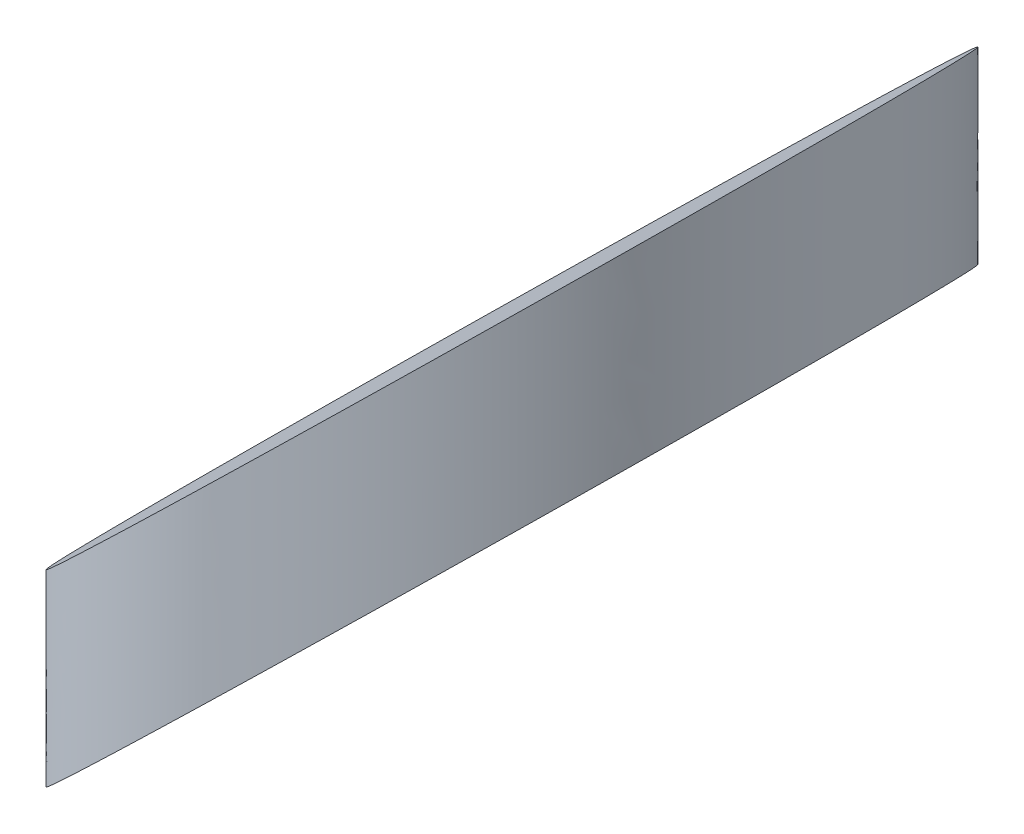
ISO-10303-21;
HEADER;
FILE_DESCRIPTION(('STEP AP214'),'2;1');
FILE_NAME('part.step','',(''),(''),'','','');
FILE_SCHEMA(('AUTOMOTIVE_DESIGN { 1 0 10303 214 1 1 1 1 }'));
ENDSEC;
DATA;
#1=APPLICATION_CONTEXT('core data for automotive mechanical design processes');
#2=APPLICATION_PROTOCOL_DEFINITION('international standard','automotive_design',2000,#1);
#3=PRODUCT_CONTEXT('',#1,'mechanical');
#4=PRODUCT('Part','Part','',(#3));
#5=PRODUCT_RELATED_PRODUCT_CATEGORY('part','',(#4));
#6=PRODUCT_DEFINITION_FORMATION('','',#4);
#7=PRODUCT_DEFINITION_CONTEXT('part definition',#1,'design');
#8=PRODUCT_DEFINITION('design','',#6,#7);
#9=PRODUCT_DEFINITION_SHAPE('','',#8);
#10=(LENGTH_UNIT() NAMED_UNIT(*) SI_UNIT(.MILLI.,.METRE.));
#11=(NAMED_UNIT(*) PLANE_ANGLE_UNIT() SI_UNIT($,.RADIAN.));
#12=(NAMED_UNIT(*) SI_UNIT($,.STERADIAN.) SOLID_ANGLE_UNIT());
#13=UNCERTAINTY_MEASURE_WITH_UNIT(LENGTH_MEASURE(1.E-05),#10,'distance_accuracy_value','');
#14=(GEOMETRIC_REPRESENTATION_CONTEXT(3) GLOBAL_UNCERTAINTY_ASSIGNED_CONTEXT((#13)) GLOBAL_UNIT_ASSIGNED_CONTEXT((#10,
#11,#12)) REPRESENTATION_CONTEXT('',''));
#15=CARTESIAN_POINT('',(0.,0.,0.));
#16=DIRECTION('',(0.,0.,1.));
#17=DIRECTION('',(1.,0.,0.));
#18=AXIS2_PLACEMENT_3D('',#15,#16,#17);
#19=CARTESIAN_POINT('',(0.,44.,0.));
#20=DIRECTION('',(0.,1.,0.));
#21=DIRECTION('',(0.,0.,-1.));
#22=AXIS2_PLACEMENT_3D('',#19,#20,#21);
#23=ELLIPSE('',#22,17.5,17.5);
#24=DIRECTION('',(0.,-1.,0.));
#25=VECTOR('',#24,1.);
#26=SURFACE_OF_LINEAR_EXTRUSION('',#23,#25);
#27=CARTESIAN_POINT('',(0.,17.,-17.5));
#28=CARTESIAN_POINT('',(-0.524606926554521,16.4903818427756,-17.4999960559925));
#29=CARTESIAN_POINT('',(-1.04914605312497,15.9808295483929,-17.4764278831096));
#30=CARTESIAN_POINT('',(-2.09590161314431,14.9639812900884,-17.3819810766052));
#31=CARTESIAN_POINT('',(-2.61811874873909,14.456684644082,-17.3111178852788));
#32=CARTESIAN_POINT('',(-3.65825514573321,13.4462664298592,-17.1215284082979));
#33=CARTESIAN_POINT('',(-4.17617286293149,12.9431463617237,-17.0027856257258));
#34=CARTESIAN_POINT('',(-5.20510689683075,11.9436104430787,-16.7165202697278));
#35=CARTESIAN_POINT('',(-5.71612258574639,11.4471952024178,-16.5489932899056));
#36=CARTESIAN_POINT('',(-6.72866658534818,10.4635810313761,-16.1638057737916));
#37=CARTESIAN_POINT('',(-7.2301897973215,9.97638705403056,-15.9461190782467));
#38=CARTESIAN_POINT('',(-8.22022037130111,9.01464306787894,-15.4590528783188));
#39=CARTESIAN_POINT('',(-8.70872782642266,8.54009296861801,-15.1896737438587));
#40=CARTESIAN_POINT('',(-9.64790171681812,7.62775261794813,-14.6102382210477));
#41=CARTESIAN_POINT('',(-10.0992897777334,7.18926135877332,-14.3024621315954));
#42=CARTESIAN_POINT('',(-10.9823826368693,6.33139972418416,-13.6360970336621));
#43=CARTESIAN_POINT('',(-11.4140909601209,5.91202592445397,-13.2775171727882));
#44=CARTESIAN_POINT('',(-12.1844961482825,5.16363231309705,-12.5704084465056));
#45=CARTESIAN_POINT('',(-12.5269005620064,4.83101088262242,-12.2297308260006));
#46=CARTESIAN_POINT('',(-13.1907322740163,4.18614579095563,-11.5106011289895));
#47=CARTESIAN_POINT('',(-13.5121622884441,3.87389949122575,-11.1321539596817));
#48=CARTESIAN_POINT('',(-14.0851322085372,3.31730014027819,-10.3944485611565));
#49=CARTESIAN_POINT('',(-14.3400622585669,3.06965380596358,-10.0403095437129));
#50=CARTESIAN_POINT('',(-14.8282297442058,2.59543396277154,-9.30421789312223));
#51=CARTESIAN_POINT('',(-15.0614773001439,2.3688506227174,-8.92227838582616));
#52=CARTESIAN_POINT('',(-15.4744623077741,1.96766518673375,-8.18210082162566));
#53=CARTESIAN_POINT('',(-15.6572227671813,1.7901264547382,-7.8271421680975));
#54=CARTESIAN_POINT('',(-16.001405847357,1.45577717685319,-7.09704069998454));
#55=CARTESIAN_POINT('',(-16.1628068710224,1.29898761100682,-6.72187798755732));
#56=CARTESIAN_POINT('',(-16.4479948391355,1.02194787055407,-5.98784211398234));
#57=CARTESIAN_POINT('',(-16.5738592872436,0.899679549534794,-5.63053922965544));
#58=CARTESIAN_POINT('',(-16.803662421838,0.676442218786016,-4.90231624971735));
#59=CARTESIAN_POINT('',(-16.9075956516281,0.575478509847061,-4.53139279206605));
#60=CARTESIAN_POINT('',(-17.0917006887497,0.39663361664316,-3.77811070453929));
#61=CARTESIAN_POINT('',(-17.1718664948176,0.318758262177271,-3.3957492133507));
#62=CARTESIAN_POINT('',(-17.3068445862854,0.187636687608536,-2.6224300956975));
#63=CARTESIAN_POINT('',(-17.3616597516338,0.134387669841519,-2.23147345097026));
#64=CARTESIAN_POINT('',(-17.4434463379271,0.0549378431565913,-1.45698925448872));
#65=CARTESIAN_POINT('',(-17.4712695112186,0.0279096176733809,-1.07363672412698));
#66=CARTESIAN_POINT('',(-17.501568834785,-0.00152401093399386,-0.30497780661639));
#67=CARTESIAN_POINT('',(-17.5040450279732,-0.00392945574536766,0.0803285772234218));
#68=CARTESIAN_POINT('',(-17.4836018859869,0.0159295964699111,0.849490455095918));
#69=CARTESIAN_POINT('',(-17.4606911351887,0.0381857543881888,1.23334639555591));
#70=CARTESIAN_POINT('',(-17.3899585159038,0.106897441693517,1.99654816887916));
#71=CARTESIAN_POINT('',(-17.342137478981,0.153352163275642,2.37589415186305));
#72=CARTESIAN_POINT('',(-17.2271610452325,0.26504355605985,3.09808568881684));
#73=CARTESIAN_POINT('',(-17.1617853448114,0.328551379326053,3.44148651586152));
#74=CARTESIAN_POINT('',(-17.0116731862576,0.474374619064083,4.11991097572701));
#75=CARTESIAN_POINT('',(-16.9269383344308,0.556688475124363,4.45493530102228));
#76=CARTESIAN_POINT('',(-16.739292264731,0.738973228547097,5.11506560126851));
#77=CARTESIAN_POINT('',(-16.6363738515225,0.838951115663865,5.44016758995211));
#78=CARTESIAN_POINT('',(-16.4137204216668,1.05524301895226,6.07900202222873));
#79=CARTESIAN_POINT('',(-16.2939821363047,1.17156021044688,6.39273224092756));
#80=CARTESIAN_POINT('',(-15.9943460166377,1.46263529812344,7.11568977554279));
#81=CARTESIAN_POINT('',(-15.808079553715,1.64357986210548,7.51980821502257));
#82=CARTESIAN_POINT('',(-15.4107811963374,2.02952683784371,8.30367855529781));
#83=CARTESIAN_POINT('',(-15.1997408478611,2.23453746207782,8.6834220694382));
#84=CARTESIAN_POINT('',(-14.7559701406924,2.66562900618458,9.41783145799036));
#85=CARTESIAN_POINT('',(-14.5232234941541,2.89172574853607,9.77247814368749));
#86=CARTESIAN_POINT('',(-14.0391749861886,3.36194429913105,10.4559521720424));
#87=CARTESIAN_POINT('',(-13.7878770413072,3.60606230273017,10.7847849344528));
#88=CARTESIAN_POINT('',(-13.1816527522753,4.19496589778975,11.5235882917968));
#89=CARTESIAN_POINT('',(-12.8203850817355,4.5459116348855,11.9234679142759));
#90=CARTESIAN_POINT('',(-12.0750053808954,5.26999477284447,12.6777420940203));
#91=CARTESIAN_POINT('',(-11.6909200108229,5.64310627520066,13.0321882635486));
#92=CARTESIAN_POINT('',(-10.9042407231039,6.40730901184196,13.6971722168367));
#93=CARTESIAN_POINT('',(-10.5016647604192,6.79838280416426,14.0077514503163));
#94=CARTESIAN_POINT('',(-9.68117251696826,7.59543241208799,14.5868823025996));
#95=CARTESIAN_POINT('',(-9.26325188632354,8.00141245328573,14.8554218887358));
#96=CARTESIAN_POINT('',(-8.41556065628939,8.82488393389033,15.3515241218182));
#97=CARTESIAN_POINT('',(-7.98580086716659,9.24236487189533,15.5791228092543));
#98=CARTESIAN_POINT('',(-7.11666085685907,10.0866723104798,15.9948482725881));
#99=CARTESIAN_POINT('',(-6.67728174823781,10.5134977302833,16.182979586896));
#100=CARTESIAN_POINT('',(-5.79121827339996,11.3742451058401,16.5207894201707));
#101=CARTESIAN_POINT('',(-5.34453735297434,11.8081637142535,16.6704855498757));
#102=CARTESIAN_POINT('',(-4.44554062578596,12.6814748206651,16.9324067835878));
#103=CARTESIAN_POINT('',(-3.99322407390009,13.1208680424971,17.0446268769233));
#104=CARTESIAN_POINT('',(-2.87530557837672,14.2068460095769,17.2754696300478));
#105=CARTESIAN_POINT('',(-2.20743868316754,14.8556309934944,17.3732267481338));
#106=CARTESIAN_POINT('',(-0.868092014905652,16.1567106140917,17.4913844067133));
#107=CARTESIAN_POINT('',(-0.196611302294552,16.8090061634853,17.5117637496333));
#108=CARTESIAN_POINT('',(1.13822471531653,18.1057040091646,17.4755684515093));
#109=CARTESIAN_POINT('',(1.80159116743961,18.7501171340842,17.4198013547316));
#110=CARTESIAN_POINT('',(3.12272618333686,20.0335054352415,17.2320542757256));
#111=CARTESIAN_POINT('',(3.78049539354523,20.6724812394439,17.1000832190406));
#112=CARTESIAN_POINT('',(5.03202171901242,21.8882496698978,16.772362876184));
#113=CARTESIAN_POINT('',(5.62660360422474,22.4658435012469,16.5827334678691));
#114=CARTESIAN_POINT('',(6.80260479450901,23.6082446575231,16.135988673975));
#115=CARTESIAN_POINT('',(7.38402606508318,24.1730538917951,15.8788834389332));
#116=CARTESIAN_POINT('',(8.45398564640285,25.2124431993628,15.3327231381343));
#117=CARTESIAN_POINT('',(8.94476134375127,25.6891967339298,15.0521858883735));
#118=CARTESIAN_POINT('',(9.90832913123729,26.6252340132019,14.436133486413));
#119=CARTESIAN_POINT('',(10.3811226738233,27.0845191688569,14.100622786179));
#120=CARTESIAN_POINT('',(11.2343286395916,27.9133478213175,13.4271822465152));
#121=CARTESIAN_POINT('',(11.6179563228424,28.2860147136183,13.0971727114277));
#122=CARTESIAN_POINT('',(12.3645163850943,29.0112444883773,12.3948064766997));
#123=CARTESIAN_POINT('',(12.7274609995334,29.3638192566896,12.022475211987));
#124=CARTESIAN_POINT('',(13.3755452686723,29.9933868324246,11.2936004847379));
#125=CARTESIAN_POINT('',(13.6641747958407,30.2737698016739,10.9431112534954));
#126=CARTESIAN_POINT('',(14.0811568729757,30.6788381051764,10.3934597897799));
#127=CARTESIAN_POINT('',(14.217580224584,30.8113636467387,10.2061171402502));
#128=CARTESIAN_POINT('',(14.4846264817279,31.0707800108214,9.82344426777346));
#129=CARTESIAN_POINT('',(14.6152475347543,31.1976690337614,9.62811153151285));
#130=CARTESIAN_POINT('',(14.9661484566891,31.5385442150694,9.07944588912648));
#131=CARTESIAN_POINT('',(15.1798871976061,31.7461761348173,8.71788270467582));
#132=CARTESIAN_POINT('',(15.5849334750349,32.1396496614625,7.97120981111941));
#133=CARTESIAN_POINT('',(15.7762469148095,32.3254970029578,7.58610633958323));
#134=CARTESIAN_POINT('',(16.1333657933391,32.672412484958,6.79362303374295));
#135=CARTESIAN_POINT('',(16.2991788797413,32.8334880546058,6.38624992805556));
#136=CARTESIAN_POINT('',(16.6021088051349,33.1277628392739,5.55130714173637));
#137=CARTESIAN_POINT('',(16.7392358480327,33.2609719666603,5.1237447092065));
#138=CARTESIAN_POINT('',(16.9547947364915,33.4703720297346,4.34844460060883));
#139=CARTESIAN_POINT('',(17.0394983223919,33.5526555131807,4.00407889991096));
#140=CARTESIAN_POINT('',(17.1884208382718,33.6973231000355,3.30684101124846));
#141=CARTESIAN_POINT('',(17.2526424091056,33.7597097688454,2.95396992624343));
#142=CARTESIAN_POINT('',(17.3594961550171,33.863510550588,2.24216941745266));
#143=CARTESIAN_POINT('',(17.4021432534631,33.904939160507,1.88324435935675));
#144=CARTESIAN_POINT('',(17.4651620982345,33.9661574668564,1.16159020282718));
#145=CARTESIAN_POINT('',(17.4855333553275,33.9859466880324,0.798861021022202));
#146=CARTESIAN_POINT('',(17.5036379766647,34.0035340344743,0.0717076712283288));
#147=CARTESIAN_POINT('',(17.501334243217,34.0012961219822,-0.292718299084265));
#148=CARTESIAN_POINT('',(17.4740429084325,33.9747845396202,-1.01991001841539));
#149=CARTESIAN_POINT('',(17.4490552686352,33.9505108323885,-1.38267576461796));
#150=CARTESIAN_POINT('',(17.3768413073518,33.8803601271418,-2.10400284189761));
#151=CARTESIAN_POINT('',(17.3296065912754,33.8344749743818,-2.46256253349708));
#152=CARTESIAN_POINT('',(17.2137272811793,33.7219065017171,-3.17286868125792));
#153=CARTESIAN_POINT('',(17.1450827726619,33.6552232648715,-3.52461516462253));
#154=CARTESIAN_POINT('',(16.9886917817009,33.503300587938,-4.21395461709947));
#155=CARTESIAN_POINT('',(16.9012453590712,33.4183526345263,-4.55168041713726));
#156=CARTESIAN_POINT('',(16.7079558633457,33.2305856958215,-5.21671726068725));
#157=CARTESIAN_POINT('',(16.6021123031379,33.127766237334,-5.5440280281629));
#158=CARTESIAN_POINT('',(16.37345236966,32.9056394448126,-6.18679182869626));
#159=CARTESIAN_POINT('',(16.2506399450883,32.7863359466572,-6.50224759878207));
#160=CARTESIAN_POINT('',(15.9894907129257,32.5326481211278,-7.12030631549743));
#161=CARTESIAN_POINT('',(15.8511555505256,32.3982653919391,-7.42291061952351));
#162=CARTESIAN_POINT('',(15.5006815324961,32.0578049172819,-8.13602766303885));
#163=CARTESIAN_POINT('',(15.2815454613302,31.8449298767208,-8.53988622036485));
#164=CARTESIAN_POINT('',(14.8191746948617,31.3957697035799,-9.3191911917452));
#165=CARTESIAN_POINT('',(14.57595540003,31.1594995314577,-9.69465549551835));
#166=CARTESIAN_POINT('',(14.0689993877566,30.6670279766778,-10.4166986479584));
#167=CARTESIAN_POINT('',(13.8052861461071,30.4108493990754,-10.7633096318578));
#168=CARTESIAN_POINT('',(13.2600845051393,29.8812249478496,-11.4282588468705));
#169=CARTESIAN_POINT('',(12.9785913485936,29.6077744529195,-11.7465894559366));
#170=CARTESIAN_POINT('',(12.2965670888303,28.945236600578,-12.4647536580369));
#171=CARTESIAN_POINT('',(11.8896130235181,28.5499097942748,-12.8527624778902));
#172=CARTESIAN_POINT('',(11.0533377829376,27.7375281319965,-13.5786772931745));
#173=CARTESIAN_POINT('',(10.6240098191395,27.3204666814499,-13.9165679610943));
#174=CARTESIAN_POINT('',(9.74819756150339,26.4696776311747,-14.5434595704953));
#175=CARTESIAN_POINT('',(9.30173814277523,26.0359741958388,-14.8325283338861));
#176=CARTESIAN_POINT('',(8.39489968252244,25.155045405879,-15.3639782468892));
#177=CARTESIAN_POINT('',(7.93452294122149,24.707822285758,-15.606367063374));
#178=CARTESIAN_POINT('',(7.00322457097415,23.8031324403749,-16.0458634971754));
#179=CARTESIAN_POINT('',(6.53231166674319,23.3456741905505,-16.2430071610991));
#180=CARTESIAN_POINT('',(5.58210526016477,22.4226165384458,-16.5935715665899));
#181=CARTESIAN_POINT('',(5.10280929518099,21.9570147438901,-16.7469792231295));
#182=CARTESIAN_POINT('',(3.86026444994536,20.7499711799469,-17.0871223749831));
#183=CARTESIAN_POINT('',(3.09246431013057,20.004108186984,-17.2421648266842));
#184=CARTESIAN_POINT('',(1.54972738913154,18.5054494637278,-17.4486128561246));
#185=CARTESIAN_POINT('',(0.774789751187242,17.7526529011533,-17.500005824888));
#186=CARTESIAN_POINT('',(0.,17.,-17.5));
#187=B_SPLINE_CURVE_WITH_KNOTS('',3,(#27,#28,#29,#30,#31,#32,#33,#34,#35,#36,#37,#38,#39,#40,
#41,#42,#43,#44,#45,#46,#47,#48,#49,#50,#51,#52,#53,#54,#55,#56,#57,#58,#59,#60,#61,#62,#63,#64,
#65,#66,#67,#68,#69,#70,#71,#72,#73,#74,#75,#76,#77,#78,#79,#80,#81,#82,#83,#84,#85,#86,#87,#88,
#89,#90,#91,#92,#93,#94,#95,#96,#97,#98,#99,#100,#101,#102,#103,#104,#105,#106,#107,#108,#109,
#110,#111,#112,#113,#114,#115,#116,#117,#118,#119,#120,#121,#122,#123,#124,#125,#126,#127,#128,
#129,#130,#131,#132,#133,#134,#135,#136,#137,#138,#139,#140,#141,#142,#143,#144,#145,#146,#147,
#148,#149,#150,#151,#152,#153,#154,#155,#156,#157,#158,#159,#160,#161,#162,#163,#164,#165,#166,
#167,#168,#169,#170,#171,#172,#173,#174,#175,#176,#177,#178,#179,#180,#181,#182,#183,#184,#185,
#186),.UNSPECIFIED.,.T.,.F.,(4,2,2,2,2,2,2,2,2,2,2,2,2,2,2,2,2,2,2,2,2,2,2,2,2,2,2,2,2,2,2,2,2,
2,2,2,2,2,2,2,2,2,2,2,2,2,2,2,2,2,2,2,2,2,2,2,2,2,2,2,2,2,2,2,2,2,2,2,2,2,2,2,2,2,2,2,2,2,2,4),
(0.,2.19360699867973,4.38649811297093,6.58014543460271,8.77399095728362,10.9689832124178,
13.1639597602687,15.2634169767948,17.3624966493004,19.1201649312611,20.8776051452067,
22.3812913446195,23.8842721352492,25.1937497666424,26.5045414914228,27.6974254649935,
28.8906058904117,30.0840873372611,31.2774331658488,32.4317627243301,33.5860903284916,
34.7400277258037,35.8939266044419,36.95865475314,38.0232945891614,39.0883566564401,
40.153625991225,41.5926039183319,43.032074328088,44.4726337059581,45.9128898182862,
47.8394254418483,49.7637527564707,51.6862494391127,53.6092953802947,55.5306400798307,
57.4517637199126,59.3720055370989,61.2925039943589,64.0977188204691,66.9037020772912,
69.6801574527364,72.4562876961585,75.0046878522702,77.5527048664529,79.7689832099156,
81.9850821590903,83.8685847924866,85.7509613860897,87.3501009295726,88.1507899674666,
88.9517328317791,90.3557176118786,91.7593319714038,93.1625245576123,94.565217162577,
95.6562433781053,96.74712886494,97.8372587355071,98.9274125475348,100.019350214942,
101.111289733731,102.20364160952,103.295989122955,104.372050295251,105.448139963398,
106.523979643122,107.599705406545,109.116700007302,110.632730726325,112.147049731179,
113.661775640645,115.720880704549,117.780614206793,119.837462425591,121.893972532017,
123.948838494194,126.004318591734,129.243653449164,132.483382348422),.UNSPECIFIED.);
#188=CARTESIAN_POINT('',(0.,17.,-17.5));
#189=VERTEX_POINT('',#188);
#190=EDGE_CURVE('E78',#189,#189,#187,.T.);
#191=ORIENTED_EDGE('',*,*,#190,.T.);
#192=EDGE_LOOP('',(#191));
#193=FACE_BOUND('',#192,.T.);
#194=CARTESIAN_POINT('',(17.5,44.,0.));
#195=CARTESIAN_POINT('',(17.4999965181253,43.9999966176074,0.393228888710885));
#196=CARTESIAN_POINT('',(17.4867183617546,43.9870978371331,0.786524792473341));
#197=CARTESIAN_POINT('',(17.4338708255424,43.9357602305269,1.56983913006137));
#198=CARTESIAN_POINT('',(17.3942867657223,43.8973071438446,1.95985561067548));
#199=CARTESIAN_POINT('',(17.2895453478577,43.7955583379189,2.73394780579316));
#200=CARTESIAN_POINT('',(17.2243368737937,43.7322129631139,3.11801004098227));
#201=CARTESIAN_POINT('',(17.0696547893781,43.5819503668244,3.87642601929348));
#202=CARTESIAN_POINT('',(16.9801840333277,43.4950359180898,4.25078089875123));
#203=CARTESIAN_POINT('',(16.7793318849296,43.299922402503,4.98475331297417));
#204=CARTESIAN_POINT('',(16.6681127656851,43.1918809723797,5.34445750104463));
#205=CARTESIAN_POINT('',(16.4251545035143,42.9558643748424,6.05008774877857));
#206=CARTESIAN_POINT('',(16.2934151663811,42.8278890187702,6.39601367800327));
#207=CARTESIAN_POINT('',(16.0112645330345,42.5537998320907,7.07275276600087));
#208=CARTESIAN_POINT('',(15.8608507093323,42.4076835462085,7.40356387075869));
#209=CARTESIAN_POINT('',(15.5431988507976,42.0991074550605,8.04912752107138));
#210=CARTESIAN_POINT('',(15.3759569822016,41.9366439255673,8.36387638260005));
#211=CARTESIAN_POINT('',(14.9571399099255,41.5297930553562,9.09816091400919));
#212=CARTESIAN_POINT('',(14.6984087581935,41.2784542222451,9.50979292596414));
#213=CARTESIAN_POINT('',(14.1560168411111,40.7515592170794,10.2998543064512));
#214=CARTESIAN_POINT('',(13.8723458383683,40.4759931001292,10.6782699116312));
#215=CARTESIAN_POINT('',(13.2838894597472,39.9043497608972,11.4020127965517));
#216=CARTESIAN_POINT('',(12.9790939622629,39.6082627061982,11.7473240231398));
#217=CARTESIAN_POINT('',(12.3519747847326,38.9990612194545,12.405045552887));
#218=CARTESIAN_POINT('',(12.0296564080191,38.6859519392186,12.717465727449));
#219=CARTESIAN_POINT('',(11.3647308353669,38.0400242400707,13.3152579205249));
#220=CARTESIAN_POINT('',(11.0218742553839,37.706963562373,13.6000893208404));
#221=CARTESIAN_POINT('',(10.3238809327441,37.0289129060943,14.1372273425144));
#222=CARTESIAN_POINT('',(9.96875880913471,36.6839371288737,14.389571096582));
#223=CARTESIAN_POINT('',(9.0776121809881,35.8182518329599,14.9749878813788));
#224=CARTESIAN_POINT('',(8.53540012036498,35.2915315454974,15.2898624798991));
#225=CARTESIAN_POINT('',(7.43360157218218,34.2212129558341,15.8548158010873));
#226=CARTESIAN_POINT('',(6.8740026249407,33.6776025499424,16.1048467979865));
#227=CARTESIAN_POINT('',(5.74308932100129,32.579001054687,16.5418833833208));
#228=CARTESIAN_POINT('',(5.1717905468706,32.0240251026743,16.7289676669721));
#229=CARTESIAN_POINT('',(4.02083623181667,30.9059551966219,17.0422569616906));
#230=CARTESIAN_POINT('',(3.4411823868141,30.342862890048,17.1684741532775));
#231=CARTESIAN_POINT('',(2.27700536162494,29.2119480655785,17.3612569333733));
#232=CARTESIAN_POINT('',(1.69248379497892,28.6441271151224,17.4278415519585));
#233=CARTESIAN_POINT('',(0.521501939067616,27.5066018836657,17.5020635033094));
#234=CARTESIAN_POINT('',(-0.0649584350596279,26.9368975202278,17.5096982207154));
#235=CARTESIAN_POINT('',(-1.2367559571437,25.7985799273461,17.4660868261012));
#236=CARTESIAN_POINT('',(-1.82209310715265,25.2299666959089,17.4148408217589));
#237=CARTESIAN_POINT('',(-2.9885511023408,24.0968360720118,17.2529785831253));
#238=CARTESIAN_POINT('',(-3.5696719463022,23.532318680735,17.142362331687));
#239=CARTESIAN_POINT('',(-4.72462892822021,22.4103604697289,16.8606459630511));
#240=CARTESIAN_POINT('',(-5.29846163254905,21.8529229855238,16.6895183580234));
#241=CARTESIAN_POINT('',(-6.4348280316004,20.7490241978739,16.2851675943469));
#242=CARTESIAN_POINT('',(-6.9973619088945,20.2025627170739,16.0519454399196));
#243=CARTESIAN_POINT('',(-8.0655720567874,19.1648728591208,15.5409349805848));
#244=CARTESIAN_POINT('',(-8.5723735405405,18.6725514177607,15.2677271236745));
#245=CARTESIAN_POINT('',(-9.56819632903781,17.7051807089347,14.6641910379262));
#246=CARTESIAN_POINT('',(-10.0572210122316,17.2301281595465,14.3338737320526));
#247=CARTESIAN_POINT('',(-10.9385100730391,16.3740187861906,13.6694798004969));
#248=CARTESIAN_POINT('',(-11.3340549374173,15.9897752036518,13.3438606404291));
#249=CARTESIAN_POINT('',(-12.1048852374222,15.2409686265042,12.6487553012947));
#250=CARTESIAN_POINT('',(-12.4801727452138,14.8764036189352,12.2792736214288));
#251=CARTESIAN_POINT('',(-13.1513345538172,14.2244178620061,11.5541537303343));
#252=CARTESIAN_POINT('',(-13.4506757806002,13.9336292417027,11.2047555118314));
#253=CARTESIAN_POINT('',(-14.0278018371147,13.3729925010886,10.4731887616413));
#254=CARTESIAN_POINT('',(-14.3055989799849,13.1031324194432,10.0910392152713));
#255=CARTESIAN_POINT('',(-14.7989552982464,12.6238719959892,9.34936669107065));
#256=CARTESIAN_POINT('',(-15.0177948812885,12.4112849724627,8.99410076662802));
#257=CARTESIAN_POINT('',(-15.3299540242481,12.108044662159,8.4431723305013));
#258=CARTESIAN_POINT('',(-15.4313910345834,12.009505852119,8.25638335939194));
#259=CARTESIAN_POINT('',(-15.628504994011,11.8180237201036,7.87690082892192));
#260=CARTESIAN_POINT('',(-15.7241801697984,11.7250821207673,7.68420547902621));
#261=CARTESIAN_POINT('',(-15.9827657060849,11.4738847426604,7.13803958115345));
#262=CARTESIAN_POINT('',(-16.1388535276269,11.3222565731625,6.77820739295815));
#263=CARTESIAN_POINT('',(-16.4288005511472,11.0405937503142,6.04161740357335));
#264=CARTESIAN_POINT('',(-16.5626645377087,10.910554449083,5.66486326776988));
#265=CARTESIAN_POINT('',(-16.8057907848613,10.6743746661348,4.89667969225138));
#266=CARTESIAN_POINT('',(-16.9150812534658,10.5682067823475,4.50526768693694));
#267=CARTESIAN_POINT('',(-17.1070695253084,10.3817038897004,3.71016026927083));
#268=CARTESIAN_POINT('',(-17.189782907584,10.3013537469184,3.30647220542238));
#269=CARTESIAN_POINT('',(-17.323066636148,10.1718781248848,2.51278500276551));
#270=CARTESIAN_POINT('',(-17.3751811723655,10.1212525754164,2.12329018021063));
#271=CARTESIAN_POINT('',(-17.4531294156652,10.0455314247824,1.339191817899));
#272=CARTESIAN_POINT('',(-17.4789639292072,10.0204350401987,0.944588435285914));
#273=CARTESIAN_POINT('',(-17.5024857996792,9.99758522316876,0.195545722875924));
#274=CARTESIAN_POINT('',(-17.5028573661862,9.99722427284772,-0.158734643013357));
#275=CARTESIAN_POINT('',(-17.4821328584376,10.0173566518035,-0.866184369186286));
#276=CARTESIAN_POINT('',(-17.4610304684751,10.0378561163384,-1.2193533719543));
#277=CARTESIAN_POINT('',(-17.3976795976701,10.0993969622633,-1.92235519185143));
#278=CARTESIAN_POINT('',(-17.3554084546507,10.1404603583393,-2.2721840232766));
#279=CARTESIAN_POINT('',(-17.2504241047597,10.2424451553763,-2.965788186397));
#280=CARTESIAN_POINT('',(-17.1877119749886,10.3033655100111,-3.30956383604777));
#281=CARTESIAN_POINT('',(-17.042159422784,10.444759417867,-3.99221093843587));
#282=CARTESIAN_POINT('',(-16.9591361162478,10.5254106299307,-4.33100638332242));
#283=CARTESIAN_POINT('',(-16.7745098347348,10.7047618748291,-4.99857725445047));
#284=CARTESIAN_POINT('',(-16.6729067945327,10.8034619710254,-5.32735264551122));
#285=CARTESIAN_POINT('',(-16.4524539242922,11.0176161878304,-5.97355339157706));
#286=CARTESIAN_POINT('',(-16.333599168473,11.1330750934834,-6.29097547256591));
#287=CARTESIAN_POINT('',(-16.080077689995,11.3793531011478,-6.91332505934023));
#288=CARTESIAN_POINT('',(-15.9454077337677,11.51017534434,-7.21824999271259));
#289=CARTESIAN_POINT('',(-15.6031020478422,11.8427008678105,-7.93793915691698));
#290=CARTESIAN_POINT('',(-15.3882901631158,12.0513752701161,-8.34610012428675));
#291=CARTESIAN_POINT('',(-14.9337570625187,12.4929217106961,-9.13455925048637));
#292=CARTESIAN_POINT('',(-14.694026112421,12.7258032050768,-9.51484642121113));
#293=CARTESIAN_POINT('',(-14.1929806963942,13.2125330377885,-10.2472596852186));
#294=CARTESIAN_POINT('',(-13.9316470866841,13.4663999729355,-10.5993602444057));
#295=CARTESIAN_POINT('',(-13.390787714883,13.9918062198279,-11.2749296070252));
#296=CARTESIAN_POINT('',(-13.1112660059871,14.263341594184,-11.5984047519327));
#297=CARTESIAN_POINT('',(-12.436941891175,14.9183993057158,-12.3246080208012));
#298=CARTESIAN_POINT('',(-12.0357875246802,15.3080921188821,-12.7158995836832));
#299=CARTESIAN_POINT('',(-11.2114283094242,16.1088982137022,-13.4483308883413));
#300=CARTESIAN_POINT('',(-10.7882501784519,16.5199855409324,-13.7895295633293));
#301=CARTESIAN_POINT('',(-9.92428029423013,17.3592705713193,-14.4237843452049));
#302=CARTESIAN_POINT('',(-9.4835047038201,17.7874525734319,-14.7168834207552));
#303=CARTESIAN_POINT('',(-8.58758572515651,18.6577738669908,-15.25703341933));
#304=CARTESIAN_POINT('',(-8.13243826834215,19.0999171107534,-15.5040711635895));
#305=CARTESIAN_POINT('',(-7.2113791655185,19.9946602392106,-15.9533169473276));
#306=CARTESIAN_POINT('',(-6.74547700738763,20.4472509071092,-16.155562950033));
#307=CARTESIAN_POINT('',(-5.80518899365344,21.3606735490224,-16.5167614688438));
#308=CARTESIAN_POINT('',(-5.33080380359625,21.8215048765065,-16.6757173655817));
#309=CARTESIAN_POINT('',(-4.37595479244057,22.7490724873435,-16.9513377774611));
#310=CARTESIAN_POINT('',(-3.89549321862613,23.2158065876203,-17.0680174804525));
#311=CARTESIAN_POINT('',(-2.93033712712363,24.1533867907942,-17.2599309011654));
#312=CARTESIAN_POINT('',(-2.44564254271793,24.6242329585026,-17.3351639644331));
#313=CARTESIAN_POINT('',(-1.47396476218205,25.5681485167374,-17.4446675271373));
#314=CARTESIAN_POINT('',(-0.98698194465613,26.0412175394769,-17.478944578963));
#315=CARTESIAN_POINT('',(-0.0124224484016303,26.9879324786956,-17.5067838093262));
#316=CARTESIAN_POINT('',(0.475154227261419,27.4615783921968,-17.5003461971521));
#317=CARTESIAN_POINT('',(1.44917478766505,28.4077697937318,-17.4467131618655));
#318=CARTESIAN_POINT('',(1.93561863008107,28.8803152406502,-17.3995162396566));
#319=CARTESIAN_POINT('',(2.9055677063865,29.822551486204,-17.2640513040286));
#320=CARTESIAN_POINT('',(3.38907292591085,30.2922422708849,-17.175783090001));
#321=CARTESIAN_POINT('',(4.35135634540286,31.2270318783914,-16.9575694366895));
#322=CARTESIAN_POINT('',(4.83013338675868,31.6921295757084,-16.8276140312129));
#323=CARTESIAN_POINT('',(5.7807505245611,32.6155862238593,-16.5251840915902));
#324=CARTESIAN_POINT('',(6.25259066607228,33.0739452184702,-16.3527098337912));
#325=CARTESIAN_POINT('',(7.18720088915901,33.9818522923259,-15.9640350985181));
#326=CARTESIAN_POINT('',(7.64996641262088,34.4313959436889,-15.7478132343434));
#327=CARTESIAN_POINT('',(8.56346108826849,35.3187907714608,-15.2703228907321));
#328=CARTESIAN_POINT('',(9.01418966436437,35.7566413882397,-15.009052259702));
#329=CARTESIAN_POINT('',(9.90075197621145,36.6178733483197,-14.4396316335073));
#330=CARTESIAN_POINT('',(10.3365704796847,37.0412398945508,-14.1314353528016));
#331=CARTESIAN_POINT('',(11.1888523991702,37.869170902051,-13.4666836031116));
#332=CARTESIAN_POINT('',(11.6053185857561,38.2737380547345,-13.1101350852906));
#333=CARTESIAN_POINT('',(12.3539312247013,39.0009617611384,-12.4038057431136));
#334=CARTESIAN_POINT('',(12.6894106558937,39.3268560657253,-12.0608938972543));
#335=CARTESIAN_POINT('',(13.3392456917173,39.9581243862397,-11.3380173756422));
#336=CARTESIAN_POINT('',(13.6536037357067,40.2635007718294,-10.9580569911784));
#337=CARTESIAN_POINT('',(14.213141691446,40.8070519288332,-10.2185753065078));
#338=CARTESIAN_POINT('',(14.4617415758206,41.0485489593686,-9.86408503829598));
#339=CARTESIAN_POINT('',(14.9372285465575,41.5104505880845,-9.12803321847515));
#340=CARTESIAN_POINT('',(15.1641271994131,41.730866422287,-8.74648627873248));
#341=CARTESIAN_POINT('',(15.5656926598567,42.1209585838608,-8.00706307669616));
#342=CARTESIAN_POINT('',(15.7433337939244,42.2935242569552,-7.6523273878688));
#343=CARTESIAN_POINT('',(16.0773468859406,42.6179941177709,-6.92314108406081));
#344=CARTESIAN_POINT('',(16.2336906013244,42.7698708698579,-6.54866518639007));
#345=CARTESIAN_POINT('',(16.5097200714948,43.0380137837378,-5.81540876570631));
#346=CARTESIAN_POINT('',(16.6314117180055,43.1562285260625,-5.45809723025655));
#347=CARTESIAN_POINT('',(16.8528662020858,43.3713557391691,-4.73028498458465));
#348=CARTESIAN_POINT('',(16.9526208995358,43.4682603024062,-4.35977943753102));
#349=CARTESIAN_POINT('',(17.1282594608496,43.6388806191111,-3.6085073405979));
#350=CARTESIAN_POINT('',(17.2041784551647,43.7126304993029,-3.22775679825134));
#351=CARTESIAN_POINT('',(17.3308444124963,43.8356774292821,-2.45838386934264));
#352=CARTESIAN_POINT('',(17.3816071507357,43.8849898035719,-2.06976657550447));
#353=CARTESIAN_POINT('',(17.4461015031917,43.9476414602433,-1.40060856090231));
#354=CARTESIAN_POINT('',(17.4662925377065,43.9672556080577,-1.12124883573733));
#355=CARTESIAN_POINT('',(17.4932430387084,43.9934360947453,-0.561270787145547));
#356=CARTESIAN_POINT('',(17.5000024850583,44.0000024140566,-0.28065246183242));
#357=CARTESIAN_POINT('',(17.5,44.,0.));
#358=B_SPLINE_CURVE_WITH_KNOTS('',3,(#194,#195,#196,#197,#198,#199,#200,#201,#202,#203,#204,
#205,#206,#207,#208,#209,#210,#211,#212,#213,#214,#215,#216,#217,#218,#219,#220,#221,#222,#223,
#224,#225,#226,#227,#228,#229,#230,#231,#232,#233,#234,#235,#236,#237,#238,#239,#240,#241,#242,
#243,#244,#245,#246,#247,#248,#249,#250,#251,#252,#253,#254,#255,#256,#257,#258,#259,#260,#261,
#262,#263,#264,#265,#266,#267,#268,#269,#270,#271,#272,#273,#274,#275,#276,#277,#278,#279,#280,
#281,#282,#283,#284,#285,#286,#287,#288,#289,#290,#291,#292,#293,#294,#295,#296,#297,#298,#299,
#300,#301,#302,#303,#304,#305,#306,#307,#308,#309,#310,#311,#312,#313,#314,#315,#316,#317,#318,
#319,#320,#321,#322,#323,#324,#325,#326,#327,#328,#329,#330,#331,#332,#333,#334,#335,#336,#337,
#338,#339,#340,#341,#342,#343,#344,#345,#346,#347,#348,#349,#350,#351,#352,#353,#354,#355,#356,
#357),.UNSPECIFIED.,.T.,.F.,(4,2,2,2,2,2,2,2,2,2,2,2,2,2,2,2,2,2,2,2,2,2,2,2,2,2,2,2,2,2,2,2,2,
2,2,2,2,2,2,2,2,2,2,2,2,2,2,2,2,2,2,2,2,2,2,2,2,2,2,2,2,2,2,2,2,2,2,2,2,2,2,2,2,2,2,2,2,2,2,2,2,
4),(0.,1.17937194876255,2.35940259794227,3.54179924040111,4.72405684180909,5.89780838767966,
7.07157104281666,8.24549273379269,9.41968247562825,11.0591890032731,12.6993716914792,
14.3403457647856,15.9808259294661,17.648780122421,19.3148106252777,21.7681006908192,
24.2231913192079,26.6752011183597,29.1267200256436,31.5774563198287,34.0283013422653,
36.4791418827324,38.9299831310403,41.3819391294331,43.8338554760769,46.1041617449542,
48.3740342660552,50.2933853876811,52.2125398015869,53.8437582397883,55.4740374062176,
56.8773447850105,57.5800127482941,58.2828958761742,59.5429556655374,60.8027438230683,
62.0610783981776,63.3186740075107,64.5056479706088,65.6925855077231,66.7541845437527,
67.8160958970167,68.87914651595,69.9421411284267,71.0150841068477,72.0880308519723,
73.1612845541052,74.2347580764882,75.7512445367789,77.26832563004,78.7867658422705,
80.3048688232941,82.3496283588565,84.3919626625017,86.4324624437352,88.4735451464684,
90.5128912530652,92.5520780563297,94.5905315475142,96.629017225516,98.667176730625,
100.705325758852,102.743549751842,104.781783700423,106.820505294956,108.859213639366,
110.898921056831,112.93872592064,114.98055595685,117.022092768206,118.760229064389,
120.498164272884,121.983982101387,123.469003541559,124.765573745121,126.063846935233,
127.249168334464,128.434928830201,129.618933388428,130.802194527366,131.643926033111,
132.485658800816),.UNSPECIFIED.);
#359=CARTESIAN_POINT('',(17.5,44.,0.));
#360=VERTEX_POINT('',#359);
#361=EDGE_CURVE('E11',#360,#360,#358,.T.);
#362=ORIENTED_EDGE('',*,*,#361,.T.);
#363=EDGE_LOOP('',(#362));
#364=FACE_BOUND('',#363,.T.);
#365=ADVANCED_FACE('F70',(#193,#364),#26,.F.);
#366=CARTESIAN_POINT('',(-13.4943301133977,13.8912221755565,-17.5));
#367=DIRECTION('',(0.696785684263249,-0.717279380859227,0.));
#368=DIRECTION('',(0.717279380859227,0.696785684263249,0.));
#369=AXIS2_PLACEMENT_3D('',#366,#367,#368);
#370=PLANE('',#369);
#371=ORIENTED_EDGE('',*,*,#361,.F.);
#372=EDGE_LOOP('',(#371));
#373=FACE_BOUND('',#372,.T.);
#374=ADVANCED_FACE('F90',(#373),#370,.F.);
#375=CARTESIAN_POINT('',(-8.49643007139858,8.74632507349854,-17.5));
#376=DIRECTION('',(-0.696785684263249,0.717279380859227,0.));
#377=DIRECTION('',(-0.717279380859227,-0.696785684263249,0.));
#378=AXIS2_PLACEMENT_3D('',#375,#376,#377);
#379=PLANE('',#378);
#380=ORIENTED_EDGE('',*,*,#190,.F.);
#381=EDGE_LOOP('',(#380));
#382=FACE_BOUND('',#381,.T.);
#383=ADVANCED_FACE('F93',(#382),#379,.F.);
#384=CLOSED_SHELL('',(#365,#374,#383));
#385=MANIFOLD_SOLID_BREP('B2',#384);
#386=ADVANCED_BREP_SHAPE_REPRESENTATION('',(#18,#385),#14);
#387=SHAPE_DEFINITION_REPRESENTATION(#9,#386);
ENDSEC;
END-ISO-10303-21;
